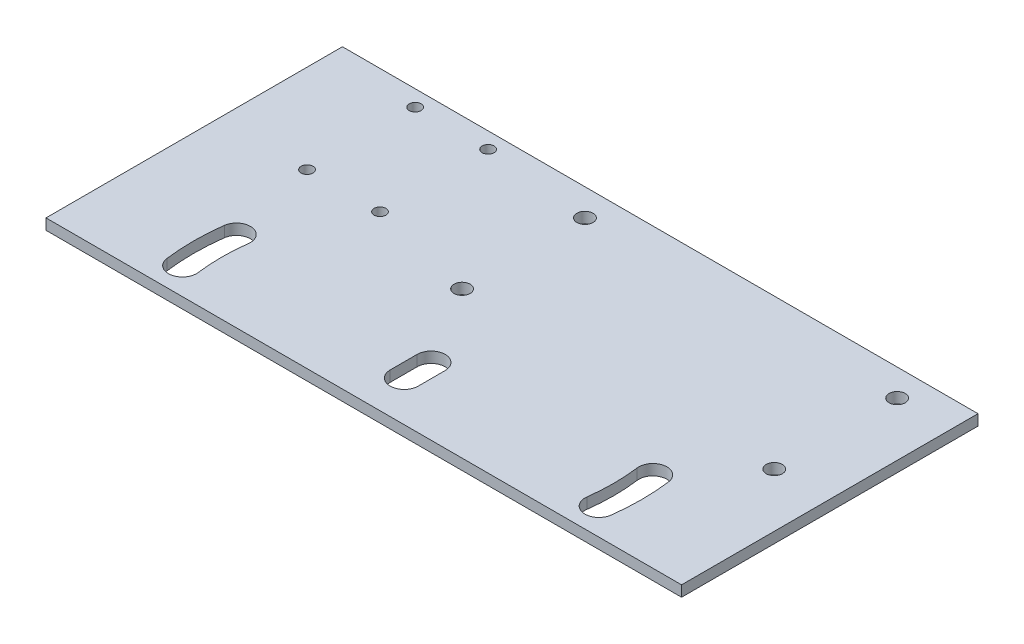
ISO-10303-21;
HEADER;
FILE_DESCRIPTION(('STEP AP214'),'2;1');
FILE_NAME('part.step','',(''),(''),'','','');
FILE_SCHEMA(('AUTOMOTIVE_DESIGN { 1 0 10303 214 1 1 1 1 }'));
ENDSEC;
DATA;
#1=APPLICATION_CONTEXT('core data for automotive mechanical design processes');
#2=APPLICATION_PROTOCOL_DEFINITION('international standard','automotive_design',2000,#1);
#3=PRODUCT_CONTEXT('',#1,'mechanical');
#4=PRODUCT('Part','Part','',(#3));
#5=PRODUCT_RELATED_PRODUCT_CATEGORY('part','',(#4));
#6=PRODUCT_DEFINITION_FORMATION('','',#4);
#7=PRODUCT_DEFINITION_CONTEXT('part definition',#1,'design');
#8=PRODUCT_DEFINITION('design','',#6,#7);
#9=PRODUCT_DEFINITION_SHAPE('','',#8);
#10=(LENGTH_UNIT() NAMED_UNIT(*) SI_UNIT(.MILLI.,.METRE.));
#11=(NAMED_UNIT(*) PLANE_ANGLE_UNIT() SI_UNIT($,.RADIAN.));
#12=(NAMED_UNIT(*) SI_UNIT($,.STERADIAN.) SOLID_ANGLE_UNIT());
#13=UNCERTAINTY_MEASURE_WITH_UNIT(LENGTH_MEASURE(1.E-05),#10,'distance_accuracy_value','');
#14=(GEOMETRIC_REPRESENTATION_CONTEXT(3) GLOBAL_UNCERTAINTY_ASSIGNED_CONTEXT((#13)) GLOBAL_UNIT_ASSIGNED_CONTEXT((#10,
#11,#12)) REPRESENTATION_CONTEXT('',''));
#15=CARTESIAN_POINT('',(0.,0.,0.));
#16=DIRECTION('',(0.,0.,1.));
#17=DIRECTION('',(1.,0.,0.));
#18=AXIS2_PLACEMENT_3D('',#15,#16,#17);
#19=CARTESIAN_POINT('',(0.,2.,0.));
#20=DIRECTION('',(0.,1.,0.));
#21=DIRECTION('',(0.,0.,1.));
#22=AXIS2_PLACEMENT_3D('',#19,#20,#21);
#23=PLANE('',#22);
#24=CARTESIAN_POINT('',(107.92,2.,27.8));
#25=DIRECTION('',(0.,1.,0.));
#26=DIRECTION('',(0.,0.,1.));
#27=AXIS2_PLACEMENT_3D('',#24,#25,#26);
#28=CIRCLE('',#27,1.50000000000001);
#29=CARTESIAN_POINT('',(107.92,2.,29.3));
#30=VERTEX_POINT('',#29);
#31=EDGE_CURVE('E252',#30,#30,#28,.T.);
#32=ORIENTED_EDGE('',*,*,#31,.F.);
#33=EDGE_LOOP('',(#32));
#34=FACE_BOUND('',#33,.T.);
#35=CARTESIAN_POINT('',(107.92,2.,5.));
#36=DIRECTION('',(0.,1.,0.));
#37=DIRECTION('',(0.,0.,-1.));
#38=AXIS2_PLACEMENT_3D('',#35,#36,#37);
#39=CIRCLE('',#38,1.50000000000001);
#40=CARTESIAN_POINT('',(107.92,2.,3.49999999999999));
#41=VERTEX_POINT('',#40);
#42=EDGE_CURVE('E264',#41,#41,#39,.T.);
#43=ORIENTED_EDGE('',*,*,#42,.F.);
#44=EDGE_LOOP('',(#43));
#45=FACE_BOUND('',#44,.T.);
#46=CARTESIAN_POINT('',(30.,2.,23.03));
#47=DIRECTION('',(0.,1.,0.));
#48=DIRECTION('',(0.,0.,1.));
#49=AXIS2_PLACEMENT_3D('',#46,#47,#48);
#50=CIRCLE('',#49,1.1);
#51=CARTESIAN_POINT('',(30.,2.,24.13));
#52=VERTEX_POINT('',#51);
#53=EDGE_CURVE('E276',#52,#52,#50,.T.);
#54=ORIENTED_EDGE('',*,*,#53,.F.);
#55=EDGE_LOOP('',(#54));
#56=FACE_BOUND('',#55,.T.);
#57=CARTESIAN_POINT('',(16.46,2.,2.97));
#58=DIRECTION('',(0.,1.,0.));
#59=DIRECTION('',(0.,0.,1.));
#60=AXIS2_PLACEMENT_3D('',#57,#58,#59);
#61=CIRCLE('',#60,1.1);
#62=CARTESIAN_POINT('',(16.46,2.,4.07));
#63=VERTEX_POINT('',#62);
#64=EDGE_CURVE('E288',#63,#63,#61,.T.);
#65=ORIENTED_EDGE('',*,*,#64,.F.);
#66=EDGE_LOOP('',(#65));
#67=FACE_BOUND('',#66,.T.);
#68=DIRECTION('',(0.,0.,1.));
#69=VECTOR('',#68,1.);
#70=CARTESIAN_POINT('',(0.,2.,0.));
#71=LINE('',#70,#69);
#72=CARTESIAN_POINT('',(0.,2.,0.));
#73=VERTEX_POINT('',#72);
#74=CARTESIAN_POINT('',(0.,2.,55.));
#75=VERTEX_POINT('',#74);
#76=EDGE_CURVE('E294',#73,#75,#71,.T.);
#77=ORIENTED_EDGE('',*,*,#76,.T.);
#78=DIRECTION('',(1.,0.,0.));
#79=VECTOR('',#78,1.);
#80=CARTESIAN_POINT('',(0.,2.,55.));
#81=LINE('',#80,#79);
#82=CARTESIAN_POINT('',(117.92,2.,55.));
#83=VERTEX_POINT('',#82);
#84=EDGE_CURVE('E297',#75,#83,#81,.T.);
#85=ORIENTED_EDGE('',*,*,#84,.T.);
#86=DIRECTION('',(0.,0.,-1.));
#87=VECTOR('',#86,1.);
#88=CARTESIAN_POINT('',(117.92,2.,0.));
#89=LINE('',#88,#87);
#90=CARTESIAN_POINT('',(117.92,2.,0.));
#91=VERTEX_POINT('',#90);
#92=EDGE_CURVE('E300',#83,#91,#89,.T.);
#93=ORIENTED_EDGE('',*,*,#92,.T.);
#94=DIRECTION('',(-1.,0.,0.));
#95=VECTOR('',#94,1.);
#96=CARTESIAN_POINT('',(0.,2.,0.));
#97=LINE('',#96,#95);
#98=EDGE_CURVE('E302',#91,#73,#97,.T.);
#99=ORIENTED_EDGE('',*,*,#98,.T.);
#100=EDGE_LOOP('',(#77,#85,#93,#99));
#101=FACE_BOUND('',#100,.T.);
#102=CARTESIAN_POINT('',(30.,2.,2.97));
#103=DIRECTION('',(0.,1.,0.));
#104=DIRECTION('',(0.,0.,-1.));
#105=AXIS2_PLACEMENT_3D('',#102,#103,#104);
#106=CIRCLE('',#105,1.1);
#107=CARTESIAN_POINT('',(30.,2.,1.87));
#108=VERTEX_POINT('',#107);
#109=EDGE_CURVE('E282',#108,#108,#106,.T.);
#110=ORIENTED_EDGE('',*,*,#109,.F.);
#111=EDGE_LOOP('',(#110));
#112=FACE_BOUND('',#111,.T.);
#113=CARTESIAN_POINT('',(16.46,2.,23.03));
#114=DIRECTION('',(0.,1.,0.));
#115=DIRECTION('',(0.,0.,-1.));
#116=AXIS2_PLACEMENT_3D('',#113,#114,#115);
#117=CIRCLE('',#116,1.1);
#118=CARTESIAN_POINT('',(16.46,2.,21.93));
#119=VERTEX_POINT('',#118);
#120=EDGE_CURVE('E270',#119,#119,#117,.T.);
#121=ORIENTED_EDGE('',*,*,#120,.F.);
#122=EDGE_LOOP('',(#121));
#123=FACE_BOUND('',#122,.T.);
#124=CARTESIAN_POINT('',(50.,2.,5.00000000000001));
#125=DIRECTION('',(0.,1.,0.));
#126=DIRECTION('',(0.,0.,1.));
#127=AXIS2_PLACEMENT_3D('',#124,#125,#126);
#128=CIRCLE('',#127,1.5);
#129=CARTESIAN_POINT('',(50.,2.,6.50000000000001));
#130=VERTEX_POINT('',#129);
#131=EDGE_CURVE('E258',#130,#130,#128,.T.);
#132=ORIENTED_EDGE('',*,*,#131,.F.);
#133=EDGE_LOOP('',(#132));
#134=FACE_BOUND('',#133,.T.);
#135=CARTESIAN_POINT('',(50.,2.,27.8));
#136=DIRECTION('',(0.,1.,0.));
#137=DIRECTION('',(0.,0.,-1.));
#138=AXIS2_PLACEMENT_3D('',#135,#136,#137);
#139=CIRCLE('',#138,1.5);
#140=CARTESIAN_POINT('',(50.,2.,26.3));
#141=VERTEX_POINT('',#140);
#142=EDGE_CURVE('E246',#141,#141,#139,.T.);
#143=ORIENTED_EDGE('',*,*,#142,.F.);
#144=EDGE_LOOP('',(#143));
#145=FACE_BOUND('',#144,.T.);
#146=CARTESIAN_POINT('',(58.96,2.,45.));
#147=DIRECTION('',(0.,1.,0.));
#148=DIRECTION('',(0.,0.,-1.));
#149=AXIS2_PLACEMENT_3D('',#146,#147,#148);
#150=CIRCLE('',#149,41.56);
#151=CARTESIAN_POINT('',(100.176325709247,2.,50.3336755646817));
#152=VERTEX_POINT('',#151);
#153=CARTESIAN_POINT('',(100.176325709247,2.,39.6663244353183));
#154=VERTEX_POINT('',#153);
#155=EDGE_CURVE('E217',#152,#154,#150,.T.);
#156=ORIENTED_EDGE('',*,*,#155,.F.);
#157=CARTESIAN_POINT('',(97.5978260258001,2.,50.));
#158=DIRECTION('',(0.,1.,0.));
#159=DIRECTION('',(0.,0.,1.));
#160=AXIS2_PLACEMENT_3D('',#157,#158,#159);
#161=CIRCLE('',#160,2.6);
#162=CARTESIAN_POINT('',(95.0193263423535,2.,49.6663244353183));
#163=VERTEX_POINT('',#162);
#164=EDGE_CURVE('E215',#163,#152,#161,.T.);
#165=ORIENTED_EDGE('',*,*,#164,.F.);
#166=CARTESIAN_POINT('',(58.96,2.,45.));
#167=DIRECTION('',(0.,-1.,0.));
#168=DIRECTION('',(0.,0.,-1.));
#169=AXIS2_PLACEMENT_3D('',#166,#167,#168);
#170=CIRCLE('',#169,36.36);
#171=CARTESIAN_POINT('',(95.0193263423535,2.,40.3336755646817));
#172=VERTEX_POINT('',#171);
#173=EDGE_CURVE('E223',#172,#163,#170,.T.);
#174=ORIENTED_EDGE('',*,*,#173,.F.);
#175=CARTESIAN_POINT('',(97.5978260258001,2.,40.));
#176=DIRECTION('',(0.,1.,0.));
#177=DIRECTION('',(0.,0.,-1.));
#178=AXIS2_PLACEMENT_3D('',#175,#176,#177);
#179=CIRCLE('',#178,2.6);
#180=EDGE_CURVE('E220',#154,#172,#179,.T.);
#181=ORIENTED_EDGE('',*,*,#180,.F.);
#182=EDGE_LOOP('',(#156,#165,#174,#181));
#183=FACE_BOUND('',#182,.T.);
#184=CARTESIAN_POINT('',(20.3221739741998,2.,40.));
#185=DIRECTION('',(0.,1.,0.));
#186=DIRECTION('',(0.,0.,1.));
#187=AXIS2_PLACEMENT_3D('',#184,#185,#186);
#188=CIRCLE('',#187,2.6);
#189=CARTESIAN_POINT('',(22.9006736576465,2.,40.3336755646817));
#190=VERTEX_POINT('',#189);
#191=CARTESIAN_POINT('',(17.7436742907532,2.,39.6663244353183));
#192=VERTEX_POINT('',#191);
#193=EDGE_CURVE('E186',#190,#192,#188,.T.);
#194=ORIENTED_EDGE('',*,*,#193,.F.);
#195=CARTESIAN_POINT('',(58.96,2.,45.));
#196=DIRECTION('',(0.,-1.,0.));
#197=DIRECTION('',(0.,0.,1.));
#198=AXIS2_PLACEMENT_3D('',#195,#196,#197);
#199=CIRCLE('',#198,36.36);
#200=CARTESIAN_POINT('',(22.9006736576465,2.,49.6663244353183));
#201=VERTEX_POINT('',#200);
#202=EDGE_CURVE('E184',#201,#190,#199,.T.);
#203=ORIENTED_EDGE('',*,*,#202,.F.);
#204=CARTESIAN_POINT('',(20.3221739741998,2.,50.));
#205=DIRECTION('',(0.,1.,0.));
#206=DIRECTION('',(0.,0.,-1.));
#207=AXIS2_PLACEMENT_3D('',#204,#205,#206);
#208=CIRCLE('',#207,2.6);
#209=CARTESIAN_POINT('',(17.7436742907532,2.,50.3336755646817));
#210=VERTEX_POINT('',#209);
#211=EDGE_CURVE('E192',#210,#201,#208,.T.);
#212=ORIENTED_EDGE('',*,*,#211,.F.);
#213=CARTESIAN_POINT('',(58.96,2.,45.));
#214=DIRECTION('',(0.,1.,0.));
#215=DIRECTION('',(0.,0.,1.));
#216=AXIS2_PLACEMENT_3D('',#213,#214,#215);
#217=CIRCLE('',#216,41.56);
#218=EDGE_CURVE('E189',#192,#210,#217,.T.);
#219=ORIENTED_EDGE('',*,*,#218,.F.);
#220=EDGE_LOOP('',(#194,#203,#212,#219));
#221=FACE_BOUND('',#220,.T.);
#222=DIRECTION('',(0.,0.,-1.));
#223=VECTOR('',#222,1.);
#224=CARTESIAN_POINT('',(61.56,2.,47.5));
#225=LINE('',#224,#223);
#226=CARTESIAN_POINT('',(61.56,2.,47.5));
#227=VERTEX_POINT('',#226);
#228=CARTESIAN_POINT('',(61.56,2.,42.5));
#229=VERTEX_POINT('',#228);
#230=EDGE_CURVE('E156',#227,#229,#225,.T.);
#231=ORIENTED_EDGE('',*,*,#230,.F.);
#232=CARTESIAN_POINT('',(58.96,2.,47.5));
#233=DIRECTION('',(0.,1.,0.));
#234=DIRECTION('',(0.,0.,1.));
#235=AXIS2_PLACEMENT_3D('',#232,#233,#234);
#236=CIRCLE('',#235,2.6);
#237=CARTESIAN_POINT('',(56.36,2.,47.5));
#238=VERTEX_POINT('',#237);
#239=EDGE_CURVE('E148',#238,#227,#236,.T.);
#240=ORIENTED_EDGE('',*,*,#239,.F.);
#241=DIRECTION('',(0.,0.,1.));
#242=VECTOR('',#241,1.);
#243=CARTESIAN_POINT('',(56.36,2.,47.5));
#244=LINE('',#243,#242);
#245=CARTESIAN_POINT('',(56.36,2.,42.5));
#246=VERTEX_POINT('',#245);
#247=EDGE_CURVE('E170',#246,#238,#244,.T.);
#248=ORIENTED_EDGE('',*,*,#247,.F.);
#249=CARTESIAN_POINT('',(58.96,2.,42.5));
#250=DIRECTION('',(0.,1.,0.));
#251=DIRECTION('',(0.,0.,-1.));
#252=AXIS2_PLACEMENT_3D('',#249,#250,#251);
#253=CIRCLE('',#252,2.6);
#254=EDGE_CURVE('E168',#229,#246,#253,.T.);
#255=ORIENTED_EDGE('',*,*,#254,.F.);
#256=EDGE_LOOP('',(#231,#240,#248,#255));
#257=FACE_BOUND('',#256,.T.);
#258=ADVANCED_FACE('F35',(#34,#45,#56,#67,#101,#112,#123,#134,#145,#183,#221,#257),#23,.T.);
#259=CARTESIAN_POINT('',(0.,0.,0.));
#260=DIRECTION('',(0.,1.,0.));
#261=DIRECTION('',(0.,0.,1.));
#262=AXIS2_PLACEMENT_3D('',#259,#260,#261);
#263=PLANE('',#262);
#264=CARTESIAN_POINT('',(58.96,0.,45.));
#265=DIRECTION('',(0.,-1.,0.));
#266=DIRECTION('',(0.,0.,1.));
#267=AXIS2_PLACEMENT_3D('',#264,#265,#266);
#268=CIRCLE('',#267,36.36);
#269=CARTESIAN_POINT('',(22.9006736576465,0.,49.6663244353183));
#270=VERTEX_POINT('',#269);
#271=CARTESIAN_POINT('',(22.9006736576465,0.,40.3336755646817));
#272=VERTEX_POINT('',#271);
#273=EDGE_CURVE('E164',#270,#272,#268,.T.);
#274=ORIENTED_EDGE('',*,*,#273,.T.);
#275=CARTESIAN_POINT('',(20.3221739741998,0.,40.));
#276=DIRECTION('',(0.,1.,0.));
#277=DIRECTION('',(0.,0.,1.));
#278=AXIS2_PLACEMENT_3D('',#275,#276,#277);
#279=CIRCLE('',#278,2.6);
#280=CARTESIAN_POINT('',(17.7436742907532,0.,39.6663244353183));
#281=VERTEX_POINT('',#280);
#282=EDGE_CURVE('E197',#272,#281,#279,.T.);
#283=ORIENTED_EDGE('',*,*,#282,.T.);
#284=CARTESIAN_POINT('',(58.96,0.,45.));
#285=DIRECTION('',(0.,1.,0.));
#286=DIRECTION('',(0.,0.,1.));
#287=AXIS2_PLACEMENT_3D('',#284,#285,#286);
#288=CIRCLE('',#287,41.56);
#289=CARTESIAN_POINT('',(17.7436742907532,0.,50.3336755646817));
#290=VERTEX_POINT('',#289);
#291=EDGE_CURVE('E200',#281,#290,#288,.T.);
#292=ORIENTED_EDGE('',*,*,#291,.T.);
#293=CARTESIAN_POINT('',(20.3221739741998,0.,50.));
#294=DIRECTION('',(0.,1.,0.));
#295=DIRECTION('',(0.,0.,-1.));
#296=AXIS2_PLACEMENT_3D('',#293,#294,#295);
#297=CIRCLE('',#296,2.6);
#298=EDGE_CURVE('E187',#290,#270,#297,.T.);
#299=ORIENTED_EDGE('',*,*,#298,.T.);
#300=EDGE_LOOP('',(#274,#283,#292,#299));
#301=FACE_BOUND('',#300,.T.);
#302=CARTESIAN_POINT('',(50.,0.,27.8));
#303=DIRECTION('',(0.,1.,0.));
#304=DIRECTION('',(0.,0.,-1.));
#305=AXIS2_PLACEMENT_3D('',#302,#303,#304);
#306=CIRCLE('',#305,1.5);
#307=CARTESIAN_POINT('',(50.,0.,26.3));
#308=VERTEX_POINT('',#307);
#309=EDGE_CURVE('E245',#308,#308,#306,.T.);
#310=ORIENTED_EDGE('',*,*,#309,.T.);
#311=EDGE_LOOP('',(#310));
#312=FACE_BOUND('',#311,.T.);
#313=CARTESIAN_POINT('',(107.92,0.,27.8));
#314=DIRECTION('',(0.,1.,0.));
#315=DIRECTION('',(0.,0.,1.));
#316=AXIS2_PLACEMENT_3D('',#313,#314,#315);
#317=CIRCLE('',#316,1.50000000000001);
#318=CARTESIAN_POINT('',(107.92,0.,29.3));
#319=VERTEX_POINT('',#318);
#320=EDGE_CURVE('E249',#319,#319,#317,.T.);
#321=ORIENTED_EDGE('',*,*,#320,.T.);
#322=EDGE_LOOP('',(#321));
#323=FACE_BOUND('',#322,.T.);
#324=CARTESIAN_POINT('',(50.,0.,5.00000000000001));
#325=DIRECTION('',(0.,1.,0.));
#326=DIRECTION('',(0.,0.,1.));
#327=AXIS2_PLACEMENT_3D('',#324,#325,#326);
#328=CIRCLE('',#327,1.5);
#329=CARTESIAN_POINT('',(50.,0.,6.50000000000001));
#330=VERTEX_POINT('',#329);
#331=EDGE_CURVE('E255',#330,#330,#328,.T.);
#332=ORIENTED_EDGE('',*,*,#331,.T.);
#333=EDGE_LOOP('',(#332));
#334=FACE_BOUND('',#333,.T.);
#335=CARTESIAN_POINT('',(107.92,0.,5.));
#336=DIRECTION('',(0.,1.,0.));
#337=DIRECTION('',(0.,0.,-1.));
#338=AXIS2_PLACEMENT_3D('',#335,#336,#337);
#339=CIRCLE('',#338,1.50000000000001);
#340=CARTESIAN_POINT('',(107.92,0.,3.49999999999999));
#341=VERTEX_POINT('',#340);
#342=EDGE_CURVE('E261',#341,#341,#339,.T.);
#343=ORIENTED_EDGE('',*,*,#342,.T.);
#344=EDGE_LOOP('',(#343));
#345=FACE_BOUND('',#344,.T.);
#346=CARTESIAN_POINT('',(16.46,0.,23.03));
#347=DIRECTION('',(0.,1.,0.));
#348=DIRECTION('',(0.,0.,-1.));
#349=AXIS2_PLACEMENT_3D('',#346,#347,#348);
#350=CIRCLE('',#349,1.1);
#351=CARTESIAN_POINT('',(16.46,0.,21.93));
#352=VERTEX_POINT('',#351);
#353=EDGE_CURVE('E267',#352,#352,#350,.T.);
#354=ORIENTED_EDGE('',*,*,#353,.T.);
#355=EDGE_LOOP('',(#354));
#356=FACE_BOUND('',#355,.T.);
#357=CARTESIAN_POINT('',(30.,0.,23.03));
#358=DIRECTION('',(0.,1.,0.));
#359=DIRECTION('',(0.,0.,1.));
#360=AXIS2_PLACEMENT_3D('',#357,#358,#359);
#361=CIRCLE('',#360,1.1);
#362=CARTESIAN_POINT('',(30.,0.,24.13));
#363=VERTEX_POINT('',#362);
#364=EDGE_CURVE('E273',#363,#363,#361,.T.);
#365=ORIENTED_EDGE('',*,*,#364,.T.);
#366=EDGE_LOOP('',(#365));
#367=FACE_BOUND('',#366,.T.);
#368=CARTESIAN_POINT('',(30.,0.,2.97));
#369=DIRECTION('',(0.,1.,0.));
#370=DIRECTION('',(0.,0.,-1.));
#371=AXIS2_PLACEMENT_3D('',#368,#369,#370);
#372=CIRCLE('',#371,1.1);
#373=CARTESIAN_POINT('',(30.,0.,1.87));
#374=VERTEX_POINT('',#373);
#375=EDGE_CURVE('E279',#374,#374,#372,.T.);
#376=ORIENTED_EDGE('',*,*,#375,.T.);
#377=EDGE_LOOP('',(#376));
#378=FACE_BOUND('',#377,.T.);
#379=CARTESIAN_POINT('',(16.46,0.,2.97));
#380=DIRECTION('',(0.,1.,0.));
#381=DIRECTION('',(0.,0.,1.));
#382=AXIS2_PLACEMENT_3D('',#379,#380,#381);
#383=CIRCLE('',#382,1.1);
#384=CARTESIAN_POINT('',(16.46,0.,4.07));
#385=VERTEX_POINT('',#384);
#386=EDGE_CURVE('E285',#385,#385,#383,.T.);
#387=ORIENTED_EDGE('',*,*,#386,.T.);
#388=EDGE_LOOP('',(#387));
#389=FACE_BOUND('',#388,.T.);
#390=DIRECTION('',(0.,0.,1.));
#391=VECTOR('',#390,1.);
#392=CARTESIAN_POINT('',(0.,0.,0.));
#393=LINE('',#392,#391);
#394=CARTESIAN_POINT('',(0.,0.,0.));
#395=VERTEX_POINT('',#394);
#396=CARTESIAN_POINT('',(0.,0.,55.));
#397=VERTEX_POINT('',#396);
#398=EDGE_CURVE('E291',#395,#397,#393,.T.);
#399=ORIENTED_EDGE('',*,*,#398,.F.);
#400=DIRECTION('',(-1.,0.,0.));
#401=VECTOR('',#400,1.);
#402=CARTESIAN_POINT('',(0.,0.,0.));
#403=LINE('',#402,#401);
#404=CARTESIAN_POINT('',(117.92,0.,0.));
#405=VERTEX_POINT('',#404);
#406=EDGE_CURVE('E298',#405,#395,#403,.T.);
#407=ORIENTED_EDGE('',*,*,#406,.F.);
#408=DIRECTION('',(0.,0.,-1.));
#409=VECTOR('',#408,1.);
#410=CARTESIAN_POINT('',(117.92,0.,0.));
#411=LINE('',#410,#409);
#412=CARTESIAN_POINT('',(117.92,0.,55.));
#413=VERTEX_POINT('',#412);
#414=EDGE_CURVE('E309',#413,#405,#411,.T.);
#415=ORIENTED_EDGE('',*,*,#414,.F.);
#416=DIRECTION('',(1.,0.,0.));
#417=VECTOR('',#416,1.);
#418=CARTESIAN_POINT('',(0.,0.,55.));
#419=LINE('',#418,#417);
#420=EDGE_CURVE('E307',#397,#413,#419,.T.);
#421=ORIENTED_EDGE('',*,*,#420,.F.);
#422=EDGE_LOOP('',(#399,#407,#415,#421));
#423=FACE_BOUND('',#422,.T.);
#424=CARTESIAN_POINT('',(97.5978260258001,0.,50.));
#425=DIRECTION('',(0.,1.,0.));
#426=DIRECTION('',(0.,0.,1.));
#427=AXIS2_PLACEMENT_3D('',#424,#425,#426);
#428=CIRCLE('',#427,2.6);
#429=CARTESIAN_POINT('',(95.0193263423535,0.,49.6663244353183));
#430=VERTEX_POINT('',#429);
#431=CARTESIAN_POINT('',(100.176325709247,0.,50.3336755646817));
#432=VERTEX_POINT('',#431);
#433=EDGE_CURVE('E214',#430,#432,#428,.T.);
#434=ORIENTED_EDGE('',*,*,#433,.T.);
#435=CARTESIAN_POINT('',(58.96,0.,45.));
#436=DIRECTION('',(0.,1.,0.));
#437=DIRECTION('',(0.,0.,-1.));
#438=AXIS2_PLACEMENT_3D('',#435,#436,#437);
#439=CIRCLE('',#438,41.56);
#440=CARTESIAN_POINT('',(100.176325709247,0.,39.6663244353183));
#441=VERTEX_POINT('',#440);
#442=EDGE_CURVE('E228',#432,#441,#439,.T.);
#443=ORIENTED_EDGE('',*,*,#442,.T.);
#444=CARTESIAN_POINT('',(97.5978260258001,0.,40.));
#445=DIRECTION('',(0.,1.,0.));
#446=DIRECTION('',(0.,0.,-1.));
#447=AXIS2_PLACEMENT_3D('',#444,#445,#446);
#448=CIRCLE('',#447,2.6);
#449=CARTESIAN_POINT('',(95.0193263423535,0.,40.3336755646817));
#450=VERTEX_POINT('',#449);
#451=EDGE_CURVE('E231',#441,#450,#448,.T.);
#452=ORIENTED_EDGE('',*,*,#451,.T.);
#453=CARTESIAN_POINT('',(58.96,0.,45.));
#454=DIRECTION('',(0.,-1.,0.));
#455=DIRECTION('',(0.,0.,-1.));
#456=AXIS2_PLACEMENT_3D('',#453,#454,#455);
#457=CIRCLE('',#456,36.36);
#458=EDGE_CURVE('E218',#450,#430,#457,.T.);
#459=ORIENTED_EDGE('',*,*,#458,.T.);
#460=EDGE_LOOP('',(#434,#443,#452,#459));
#461=FACE_BOUND('',#460,.T.);
#462=CARTESIAN_POINT('',(58.96,0.,47.5));
#463=DIRECTION('',(0.,1.,0.));
#464=DIRECTION('',(0.,0.,1.));
#465=AXIS2_PLACEMENT_3D('',#462,#463,#464);
#466=CIRCLE('',#465,2.6);
#467=CARTESIAN_POINT('',(56.36,0.,47.5));
#468=VERTEX_POINT('',#467);
#469=CARTESIAN_POINT('',(61.56,0.,47.5));
#470=VERTEX_POINT('',#469);
#471=EDGE_CURVE('E58',#468,#470,#466,.T.);
#472=ORIENTED_EDGE('',*,*,#471,.T.);
#473=DIRECTION('',(0.,0.,-1.));
#474=VECTOR('',#473,1.);
#475=CARTESIAN_POINT('',(61.56,0.,47.5));
#476=LINE('',#475,#474);
#477=CARTESIAN_POINT('',(61.56,0.,42.5));
#478=VERTEX_POINT('',#477);
#479=EDGE_CURVE('E163',#470,#478,#476,.T.);
#480=ORIENTED_EDGE('',*,*,#479,.T.);
#481=CARTESIAN_POINT('',(58.96,0.,42.5));
#482=DIRECTION('',(0.,1.,0.));
#483=DIRECTION('',(0.,0.,-1.));
#484=AXIS2_PLACEMENT_3D('',#481,#482,#483);
#485=CIRCLE('',#484,2.6);
#486=CARTESIAN_POINT('',(56.36,0.,42.5));
#487=VERTEX_POINT('',#486);
#488=EDGE_CURVE('E176',#478,#487,#485,.T.);
#489=ORIENTED_EDGE('',*,*,#488,.T.);
#490=DIRECTION('',(0.,0.,1.));
#491=VECTOR('',#490,1.);
#492=CARTESIAN_POINT('',(56.36,0.,47.5));
#493=LINE('',#492,#491);
#494=EDGE_CURVE('E157',#487,#468,#493,.T.);
#495=ORIENTED_EDGE('',*,*,#494,.T.);
#496=EDGE_LOOP('',(#472,#480,#489,#495));
#497=FACE_BOUND('',#496,.T.);
#498=ADVANCED_FACE('F327',(#301,#312,#323,#334,#345,#356,#367,#378,#389,#423,#461,#497),#263,.F.);
#499=CARTESIAN_POINT('',(0.,2.,0.));
#500=DIRECTION('',(1.,0.,0.));
#501=DIRECTION('',(0.,0.,-1.));
#502=AXIS2_PLACEMENT_3D('',#499,#500,#501);
#503=PLANE('',#502);
#504=ORIENTED_EDGE('',*,*,#398,.T.);
#505=DIRECTION('',(0.,-1.,0.));
#506=VECTOR('',#505,1.);
#507=CARTESIAN_POINT('',(0.,2.,55.));
#508=LINE('',#507,#506);
#509=EDGE_CURVE('E11',#75,#397,#508,.T.);
#510=ORIENTED_EDGE('',*,*,#509,.F.);
#511=ORIENTED_EDGE('',*,*,#76,.F.);
#512=DIRECTION('',(0.,-1.,0.));
#513=VECTOR('',#512,1.);
#514=CARTESIAN_POINT('',(0.,2.,0.));
#515=LINE('',#514,#513);
#516=EDGE_CURVE('E304',#73,#395,#515,.T.);
#517=ORIENTED_EDGE('',*,*,#516,.T.);
#518=EDGE_LOOP('',(#504,#510,#511,#517));
#519=FACE_BOUND('',#518,.T.);
#520=ADVANCED_FACE('F37',(#519),#503,.F.);
#521=CARTESIAN_POINT('',(0.,2.,55.));
#522=DIRECTION('',(0.,0.,-1.));
#523=DIRECTION('',(-1.,0.,0.));
#524=AXIS2_PLACEMENT_3D('',#521,#522,#523);
#525=PLANE('',#524);
#526=ORIENTED_EDGE('',*,*,#420,.T.);
#527=DIRECTION('',(0.,-1.,0.));
#528=VECTOR('',#527,1.);
#529=CARTESIAN_POINT('',(117.92,2.,55.));
#530=LINE('',#529,#528);
#531=EDGE_CURVE('E43',#83,#413,#530,.T.);
#532=ORIENTED_EDGE('',*,*,#531,.F.);
#533=ORIENTED_EDGE('',*,*,#84,.F.);
#534=ORIENTED_EDGE('',*,*,#509,.T.);
#535=EDGE_LOOP('',(#526,#532,#533,#534));
#536=FACE_BOUND('',#535,.T.);
#537=ADVANCED_FACE('F338',(#536),#525,.F.);
#538=CARTESIAN_POINT('',(117.92,2.,0.));
#539=DIRECTION('',(-1.,0.,0.));
#540=DIRECTION('',(0.,0.,1.));
#541=AXIS2_PLACEMENT_3D('',#538,#539,#540);
#542=PLANE('',#541);
#543=ORIENTED_EDGE('',*,*,#414,.T.);
#544=DIRECTION('',(0.,-1.,0.));
#545=VECTOR('',#544,1.);
#546=CARTESIAN_POINT('',(117.92,2.,0.));
#547=LINE('',#546,#545);
#548=EDGE_CURVE('E314',#91,#405,#547,.T.);
#549=ORIENTED_EDGE('',*,*,#548,.F.);
#550=ORIENTED_EDGE('',*,*,#92,.F.);
#551=ORIENTED_EDGE('',*,*,#531,.T.);
#552=EDGE_LOOP('',(#543,#549,#550,#551));
#553=FACE_BOUND('',#552,.T.);
#554=ADVANCED_FACE('F321',(#553),#542,.F.);
#555=CARTESIAN_POINT('',(0.,2.,0.));
#556=DIRECTION('',(0.,0.,1.));
#557=DIRECTION('',(1.,0.,0.));
#558=AXIS2_PLACEMENT_3D('',#555,#556,#557);
#559=PLANE('',#558);
#560=ORIENTED_EDGE('',*,*,#406,.T.);
#561=ORIENTED_EDGE('',*,*,#516,.F.);
#562=ORIENTED_EDGE('',*,*,#98,.F.);
#563=ORIENTED_EDGE('',*,*,#548,.T.);
#564=EDGE_LOOP('',(#560,#561,#562,#563));
#565=FACE_BOUND('',#564,.T.);
#566=ADVANCED_FACE('F331',(#565),#559,.F.);
#567=CARTESIAN_POINT('',(16.46,2.,2.97));
#568=DIRECTION('',(0.,-1.,0.));
#569=DIRECTION('',(0.,0.,-1.));
#570=AXIS2_PLACEMENT_3D('',#567,#568,#569);
#571=CYLINDRICAL_SURFACE('',#570,1.1);
#572=ORIENTED_EDGE('',*,*,#64,.T.);
#573=EDGE_LOOP('',(#572));
#574=FACE_BOUND('',#573,.T.);
#575=ORIENTED_EDGE('',*,*,#386,.F.);
#576=EDGE_LOOP('',(#575));
#577=FACE_BOUND('',#576,.T.);
#578=ADVANCED_FACE('F356',(#574,#577),#571,.F.);
#579=CARTESIAN_POINT('',(30.,2.,2.97));
#580=DIRECTION('',(0.,-1.,0.));
#581=DIRECTION('',(0.,0.,-1.));
#582=AXIS2_PLACEMENT_3D('',#579,#580,#581);
#583=CYLINDRICAL_SURFACE('',#582,1.1);
#584=ORIENTED_EDGE('',*,*,#109,.T.);
#585=EDGE_LOOP('',(#584));
#586=FACE_BOUND('',#585,.T.);
#587=ORIENTED_EDGE('',*,*,#375,.F.);
#588=EDGE_LOOP('',(#587));
#589=FACE_BOUND('',#588,.T.);
#590=ADVANCED_FACE('F363',(#586,#589),#583,.F.);
#591=CARTESIAN_POINT('',(30.,2.,23.03));
#592=DIRECTION('',(0.,-1.,0.));
#593=DIRECTION('',(0.,0.,-1.));
#594=AXIS2_PLACEMENT_3D('',#591,#592,#593);
#595=CYLINDRICAL_SURFACE('',#594,1.1);
#596=ORIENTED_EDGE('',*,*,#53,.T.);
#597=EDGE_LOOP('',(#596));
#598=FACE_BOUND('',#597,.T.);
#599=ORIENTED_EDGE('',*,*,#364,.F.);
#600=EDGE_LOOP('',(#599));
#601=FACE_BOUND('',#600,.T.);
#602=ADVANCED_FACE('F368',(#598,#601),#595,.F.);
#603=CARTESIAN_POINT('',(16.46,2.,23.03));
#604=DIRECTION('',(0.,-1.,0.));
#605=DIRECTION('',(0.,0.,-1.));
#606=AXIS2_PLACEMENT_3D('',#603,#604,#605);
#607=CYLINDRICAL_SURFACE('',#606,1.1);
#608=ORIENTED_EDGE('',*,*,#120,.T.);
#609=EDGE_LOOP('',(#608));
#610=FACE_BOUND('',#609,.T.);
#611=ORIENTED_EDGE('',*,*,#353,.F.);
#612=EDGE_LOOP('',(#611));
#613=FACE_BOUND('',#612,.T.);
#614=ADVANCED_FACE('F378',(#610,#613),#607,.F.);
#615=CARTESIAN_POINT('',(107.92,2.,5.));
#616=DIRECTION('',(0.,-1.,0.));
#617=DIRECTION('',(0.,0.,-1.));
#618=AXIS2_PLACEMENT_3D('',#615,#616,#617);
#619=CYLINDRICAL_SURFACE('',#618,1.50000000000001);
#620=ORIENTED_EDGE('',*,*,#42,.T.);
#621=EDGE_LOOP('',(#620));
#622=FACE_BOUND('',#621,.T.);
#623=ORIENTED_EDGE('',*,*,#342,.F.);
#624=EDGE_LOOP('',(#623));
#625=FACE_BOUND('',#624,.T.);
#626=ADVANCED_FACE('F385',(#622,#625),#619,.F.);
#627=CARTESIAN_POINT('',(50.,2.,5.00000000000001));
#628=DIRECTION('',(0.,-1.,0.));
#629=DIRECTION('',(0.,0.,-1.));
#630=AXIS2_PLACEMENT_3D('',#627,#628,#629);
#631=CYLINDRICAL_SURFACE('',#630,1.5);
#632=ORIENTED_EDGE('',*,*,#131,.T.);
#633=EDGE_LOOP('',(#632));
#634=FACE_BOUND('',#633,.T.);
#635=ORIENTED_EDGE('',*,*,#331,.F.);
#636=EDGE_LOOP('',(#635));
#637=FACE_BOUND('',#636,.T.);
#638=ADVANCED_FACE('F389',(#634,#637),#631,.F.);
#639=CARTESIAN_POINT('',(107.92,2.,27.8));
#640=DIRECTION('',(0.,-1.,0.));
#641=DIRECTION('',(0.,0.,-1.));
#642=AXIS2_PLACEMENT_3D('',#639,#640,#641);
#643=CYLINDRICAL_SURFACE('',#642,1.50000000000001);
#644=ORIENTED_EDGE('',*,*,#31,.T.);
#645=EDGE_LOOP('',(#644));
#646=FACE_BOUND('',#645,.T.);
#647=ORIENTED_EDGE('',*,*,#320,.F.);
#648=EDGE_LOOP('',(#647));
#649=FACE_BOUND('',#648,.T.);
#650=ADVANCED_FACE('F393',(#646,#649),#643,.F.);
#651=CARTESIAN_POINT('',(50.,2.,27.8));
#652=DIRECTION('',(0.,-1.,0.));
#653=DIRECTION('',(0.,0.,-1.));
#654=AXIS2_PLACEMENT_3D('',#651,#652,#653);
#655=CYLINDRICAL_SURFACE('',#654,1.5);
#656=ORIENTED_EDGE('',*,*,#142,.T.);
#657=EDGE_LOOP('',(#656));
#658=FACE_BOUND('',#657,.T.);
#659=ORIENTED_EDGE('',*,*,#309,.F.);
#660=EDGE_LOOP('',(#659));
#661=FACE_BOUND('',#660,.T.);
#662=ADVANCED_FACE('F397',(#658,#661),#655,.F.);
#663=CARTESIAN_POINT('',(97.5978260258001,2.,50.));
#664=DIRECTION('',(0.,-1.,0.));
#665=DIRECTION('',(0.,0.,-1.));
#666=AXIS2_PLACEMENT_3D('',#663,#664,#665);
#667=CYLINDRICAL_SURFACE('',#666,2.6);
#668=ORIENTED_EDGE('',*,*,#433,.F.);
#669=DIRECTION('',(0.,-1.,0.));
#670=VECTOR('',#669,1.);
#671=CARTESIAN_POINT('',(95.0193263423535,2.,49.6663244353183));
#672=LINE('',#671,#670);
#673=EDGE_CURVE('E225',#163,#430,#672,.T.);
#674=ORIENTED_EDGE('',*,*,#673,.F.);
#675=ORIENTED_EDGE('',*,*,#164,.T.);
#676=DIRECTION('',(0.,-1.,0.));
#677=VECTOR('',#676,1.);
#678=CARTESIAN_POINT('',(100.176325709247,2.,50.3336755646817));
#679=LINE('',#678,#677);
#680=EDGE_CURVE('E242',#152,#432,#679,.T.);
#681=ORIENTED_EDGE('',*,*,#680,.T.);
#682=EDGE_LOOP('',(#668,#674,#675,#681));
#683=FACE_BOUND('',#682,.T.);
#684=ADVANCED_FACE('F401',(#683),#667,.F.);
#685=CARTESIAN_POINT('',(58.96,2.,45.));
#686=DIRECTION('',(0.,-1.,0.));
#687=DIRECTION('',(0.,0.,-1.));
#688=AXIS2_PLACEMENT_3D('',#685,#686,#687);
#689=CYLINDRICAL_SURFACE('',#688,41.56);
#690=ORIENTED_EDGE('',*,*,#442,.F.);
#691=ORIENTED_EDGE('',*,*,#680,.F.);
#692=ORIENTED_EDGE('',*,*,#155,.T.);
#693=DIRECTION('',(0.,-1.,0.));
#694=VECTOR('',#693,1.);
#695=CARTESIAN_POINT('',(100.176325709247,2.,39.6663244353183));
#696=LINE('',#695,#694);
#697=EDGE_CURVE('E240',#154,#441,#696,.T.);
#698=ORIENTED_EDGE('',*,*,#697,.T.);
#699=EDGE_LOOP('',(#690,#691,#692,#698));
#700=FACE_BOUND('',#699,.T.);
#701=ADVANCED_FACE('F405',(#700),#689,.F.);
#702=CARTESIAN_POINT('',(97.5978260258001,2.,40.));
#703=DIRECTION('',(0.,-1.,0.));
#704=DIRECTION('',(0.,0.,-1.));
#705=AXIS2_PLACEMENT_3D('',#702,#703,#704);
#706=CYLINDRICAL_SURFACE('',#705,2.6);
#707=ORIENTED_EDGE('',*,*,#451,.F.);
#708=ORIENTED_EDGE('',*,*,#697,.F.);
#709=ORIENTED_EDGE('',*,*,#180,.T.);
#710=DIRECTION('',(0.,-1.,0.));
#711=VECTOR('',#710,1.);
#712=CARTESIAN_POINT('',(95.0193263423535,2.,40.3336755646817));
#713=LINE('',#712,#711);
#714=EDGE_CURVE('E238',#172,#450,#713,.T.);
#715=ORIENTED_EDGE('',*,*,#714,.T.);
#716=EDGE_LOOP('',(#707,#708,#709,#715));
#717=FACE_BOUND('',#716,.T.);
#718=ADVANCED_FACE('F409',(#717),#706,.F.);
#719=CARTESIAN_POINT('',(58.96,2.,45.));
#720=DIRECTION('',(0.,-1.,0.));
#721=DIRECTION('',(0.,0.,-1.));
#722=AXIS2_PLACEMENT_3D('',#719,#720,#721);
#723=CYLINDRICAL_SURFACE('',#722,36.36);
#724=ORIENTED_EDGE('',*,*,#458,.F.);
#725=ORIENTED_EDGE('',*,*,#714,.F.);
#726=ORIENTED_EDGE('',*,*,#173,.T.);
#727=ORIENTED_EDGE('',*,*,#673,.T.);
#728=EDGE_LOOP('',(#724,#725,#726,#727));
#729=FACE_BOUND('',#728,.T.);
#730=ADVANCED_FACE('F413',(#729),#723,.T.);
#731=CARTESIAN_POINT('',(58.96,2.,45.));
#732=DIRECTION('',(0.,-1.,0.));
#733=DIRECTION('',(0.,0.,-1.));
#734=AXIS2_PLACEMENT_3D('',#731,#732,#733);
#735=CYLINDRICAL_SURFACE('',#734,36.36);
#736=ORIENTED_EDGE('',*,*,#273,.F.);
#737=DIRECTION('',(0.,-1.,0.));
#738=VECTOR('',#737,1.);
#739=CARTESIAN_POINT('',(22.9006736576465,2.,49.6663244353183));
#740=LINE('',#739,#738);
#741=EDGE_CURVE('E194',#201,#270,#740,.T.);
#742=ORIENTED_EDGE('',*,*,#741,.F.);
#743=ORIENTED_EDGE('',*,*,#202,.T.);
#744=DIRECTION('',(0.,-1.,0.));
#745=VECTOR('',#744,1.);
#746=CARTESIAN_POINT('',(22.9006736576465,2.,40.3336755646817));
#747=LINE('',#746,#745);
#748=EDGE_CURVE('E211',#190,#272,#747,.T.);
#749=ORIENTED_EDGE('',*,*,#748,.T.);
#750=EDGE_LOOP('',(#736,#742,#743,#749));
#751=FACE_BOUND('',#750,.T.);
#752=ADVANCED_FACE('F417',(#751),#735,.T.);
#753=CARTESIAN_POINT('',(20.3221739741998,2.,40.));
#754=DIRECTION('',(0.,-1.,0.));
#755=DIRECTION('',(0.,0.,-1.));
#756=AXIS2_PLACEMENT_3D('',#753,#754,#755);
#757=CYLINDRICAL_SURFACE('',#756,2.6);
#758=ORIENTED_EDGE('',*,*,#282,.F.);
#759=ORIENTED_EDGE('',*,*,#748,.F.);
#760=ORIENTED_EDGE('',*,*,#193,.T.);
#761=DIRECTION('',(0.,-1.,0.));
#762=VECTOR('',#761,1.);
#763=CARTESIAN_POINT('',(17.7436742907532,2.,39.6663244353183));
#764=LINE('',#763,#762);
#765=EDGE_CURVE('E209',#192,#281,#764,.T.);
#766=ORIENTED_EDGE('',*,*,#765,.T.);
#767=EDGE_LOOP('',(#758,#759,#760,#766));
#768=FACE_BOUND('',#767,.T.);
#769=ADVANCED_FACE('F421',(#768),#757,.F.);
#770=CARTESIAN_POINT('',(58.96,2.,45.));
#771=DIRECTION('',(0.,-1.,0.));
#772=DIRECTION('',(0.,0.,-1.));
#773=AXIS2_PLACEMENT_3D('',#770,#771,#772);
#774=CYLINDRICAL_SURFACE('',#773,41.56);
#775=ORIENTED_EDGE('',*,*,#291,.F.);
#776=ORIENTED_EDGE('',*,*,#765,.F.);
#777=ORIENTED_EDGE('',*,*,#218,.T.);
#778=DIRECTION('',(0.,-1.,0.));
#779=VECTOR('',#778,1.);
#780=CARTESIAN_POINT('',(17.7436742907532,2.,50.3336755646817));
#781=LINE('',#780,#779);
#782=EDGE_CURVE('E207',#210,#290,#781,.T.);
#783=ORIENTED_EDGE('',*,*,#782,.T.);
#784=EDGE_LOOP('',(#775,#776,#777,#783));
#785=FACE_BOUND('',#784,.T.);
#786=ADVANCED_FACE('F425',(#785),#774,.F.);
#787=CARTESIAN_POINT('',(20.3221739741998,2.,50.));
#788=DIRECTION('',(0.,-1.,0.));
#789=DIRECTION('',(0.,0.,-1.));
#790=AXIS2_PLACEMENT_3D('',#787,#788,#789);
#791=CYLINDRICAL_SURFACE('',#790,2.6);
#792=ORIENTED_EDGE('',*,*,#298,.F.);
#793=ORIENTED_EDGE('',*,*,#782,.F.);
#794=ORIENTED_EDGE('',*,*,#211,.T.);
#795=ORIENTED_EDGE('',*,*,#741,.T.);
#796=EDGE_LOOP('',(#792,#793,#794,#795));
#797=FACE_BOUND('',#796,.T.);
#798=ADVANCED_FACE('F429',(#797),#791,.F.);
#799=CARTESIAN_POINT('',(58.96,2.,47.5));
#800=DIRECTION('',(0.,-1.,0.));
#801=DIRECTION('',(0.,0.,-1.));
#802=AXIS2_PLACEMENT_3D('',#799,#800,#801);
#803=CYLINDRICAL_SURFACE('',#802,2.6);
#804=ORIENTED_EDGE('',*,*,#471,.F.);
#805=DIRECTION('',(0.,-1.,0.));
#806=VECTOR('',#805,1.);
#807=CARTESIAN_POINT('',(56.36,2.,47.5));
#808=LINE('',#807,#806);
#809=EDGE_CURVE('E152',#238,#468,#808,.T.);
#810=ORIENTED_EDGE('',*,*,#809,.F.);
#811=ORIENTED_EDGE('',*,*,#239,.T.);
#812=DIRECTION('',(0.,-1.,0.));
#813=VECTOR('',#812,1.);
#814=CARTESIAN_POINT('',(61.56,2.,47.5));
#815=LINE('',#814,#813);
#816=EDGE_CURVE('E151',#227,#470,#815,.T.);
#817=ORIENTED_EDGE('',*,*,#816,.T.);
#818=EDGE_LOOP('',(#804,#810,#811,#817));
#819=FACE_BOUND('',#818,.T.);
#820=ADVANCED_FACE('F150',(#819),#803,.F.);
#821=CARTESIAN_POINT('',(61.56,2.,47.5));
#822=DIRECTION('',(-1.,0.,0.));
#823=DIRECTION('',(0.,0.,1.));
#824=AXIS2_PLACEMENT_3D('',#821,#822,#823);
#825=PLANE('',#824);
#826=ORIENTED_EDGE('',*,*,#479,.F.);
#827=ORIENTED_EDGE('',*,*,#816,.F.);
#828=ORIENTED_EDGE('',*,*,#230,.T.);
#829=DIRECTION('',(0.,-1.,0.));
#830=VECTOR('',#829,1.);
#831=CARTESIAN_POINT('',(61.56,2.,42.5));
#832=LINE('',#831,#830);
#833=EDGE_CURVE('E165',#229,#478,#832,.T.);
#834=ORIENTED_EDGE('',*,*,#833,.T.);
#835=EDGE_LOOP('',(#826,#827,#828,#834));
#836=FACE_BOUND('',#835,.T.);
#837=ADVANCED_FACE('F160',(#836),#825,.T.);
#838=CARTESIAN_POINT('',(58.96,2.,42.5));
#839=DIRECTION('',(0.,-1.,0.));
#840=DIRECTION('',(0.,0.,-1.));
#841=AXIS2_PLACEMENT_3D('',#838,#839,#840);
#842=CYLINDRICAL_SURFACE('',#841,2.6);
#843=ORIENTED_EDGE('',*,*,#488,.F.);
#844=ORIENTED_EDGE('',*,*,#833,.F.);
#845=ORIENTED_EDGE('',*,*,#254,.T.);
#846=DIRECTION('',(0.,-1.,0.));
#847=VECTOR('',#846,1.);
#848=CARTESIAN_POINT('',(56.36,2.,42.5));
#849=LINE('',#848,#847);
#850=EDGE_CURVE('E50',#246,#487,#849,.T.);
#851=ORIENTED_EDGE('',*,*,#850,.T.);
#852=EDGE_LOOP('',(#843,#844,#845,#851));
#853=FACE_BOUND('',#852,.T.);
#854=ADVANCED_FACE('F438',(#853),#842,.F.);
#855=CARTESIAN_POINT('',(56.36,2.,47.5));
#856=DIRECTION('',(1.,0.,0.));
#857=DIRECTION('',(0.,0.,-1.));
#858=AXIS2_PLACEMENT_3D('',#855,#856,#857);
#859=PLANE('',#858);
#860=ORIENTED_EDGE('',*,*,#494,.F.);
#861=ORIENTED_EDGE('',*,*,#850,.F.);
#862=ORIENTED_EDGE('',*,*,#247,.T.);
#863=ORIENTED_EDGE('',*,*,#809,.T.);
#864=EDGE_LOOP('',(#860,#861,#862,#863));
#865=FACE_BOUND('',#864,.T.);
#866=ADVANCED_FACE('F441',(#865),#859,.T.);
#867=CLOSED_SHELL('',(#258,#498,#520,#537,#554,#566,#578,#590,#602,#614,#626,#638,#650,#662,
#684,#701,#718,#730,#752,#769,#786,#798,#820,#837,#854,#866));
#868=MANIFOLD_SOLID_BREP('B2',#867);
#869=ADVANCED_BREP_SHAPE_REPRESENTATION('',(#18,#868),#14);
#870=SHAPE_DEFINITION_REPRESENTATION(#9,#869);
ENDSEC;
END-ISO-10303-21;
